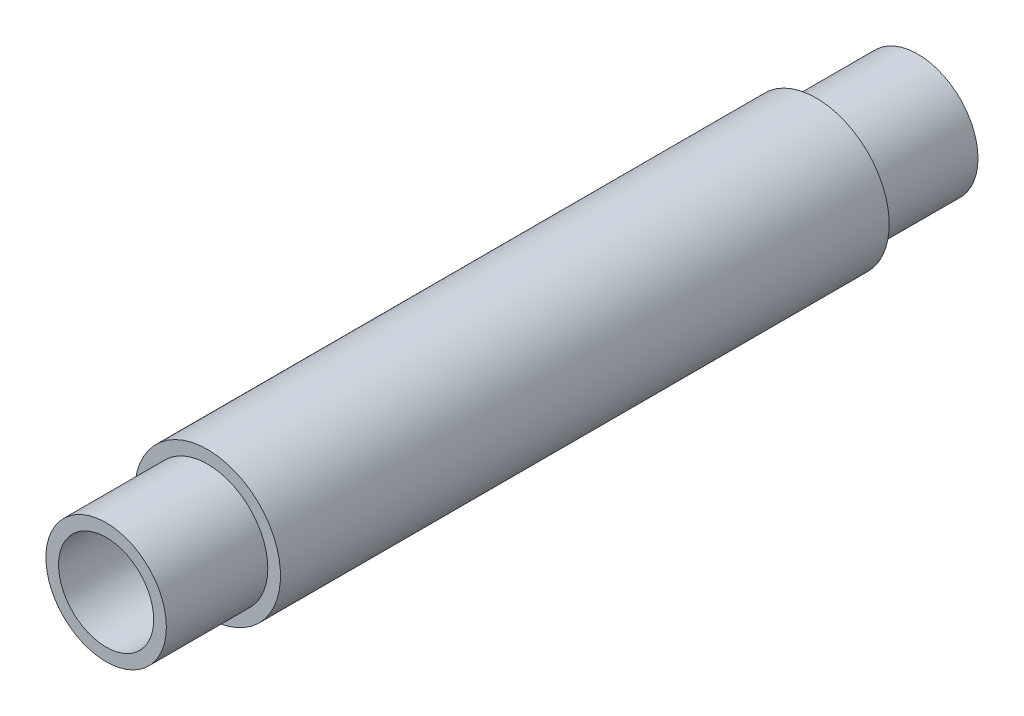
ISO-10303-21;
HEADER;
FILE_DESCRIPTION(('STEP AP214'),'2;1');
FILE_NAME('part.step','',(''),(''),'','','');
FILE_SCHEMA(('AUTOMOTIVE_DESIGN { 1 0 10303 214 1 1 1 1 }'));
ENDSEC;
DATA;
#1=APPLICATION_CONTEXT('core data for automotive mechanical design processes');
#2=APPLICATION_PROTOCOL_DEFINITION('international standard','automotive_design',2000,#1);
#3=PRODUCT_CONTEXT('',#1,'mechanical');
#4=PRODUCT('Part','Part','',(#3));
#5=PRODUCT_RELATED_PRODUCT_CATEGORY('part','',(#4));
#6=PRODUCT_DEFINITION_FORMATION('','',#4);
#7=PRODUCT_DEFINITION_CONTEXT('part definition',#1,'design');
#8=PRODUCT_DEFINITION('design','',#6,#7);
#9=PRODUCT_DEFINITION_SHAPE('','',#8);
#10=(LENGTH_UNIT() NAMED_UNIT(*) SI_UNIT(.MILLI.,.METRE.));
#11=(NAMED_UNIT(*) PLANE_ANGLE_UNIT() SI_UNIT($,.RADIAN.));
#12=(NAMED_UNIT(*) SI_UNIT($,.STERADIAN.) SOLID_ANGLE_UNIT());
#13=UNCERTAINTY_MEASURE_WITH_UNIT(LENGTH_MEASURE(1.E-05),#10,'distance_accuracy_value','');
#14=(GEOMETRIC_REPRESENTATION_CONTEXT(3) GLOBAL_UNCERTAINTY_ASSIGNED_CONTEXT((#13)) GLOBAL_UNIT_ASSIGNED_CONTEXT((#10,
#11,#12)) REPRESENTATION_CONTEXT('',''));
#15=CARTESIAN_POINT('',(0.,0.,0.));
#16=DIRECTION('',(0.,0.,1.));
#17=DIRECTION('',(1.,0.,0.));
#18=AXIS2_PLACEMENT_3D('',#15,#16,#17);
#19=CARTESIAN_POINT('',(0.,0.,101.6));
#20=DIRECTION('',(0.,0.,-1.));
#21=DIRECTION('',(-1.,0.,0.));
#22=AXIS2_PLACEMENT_3D('',#19,#20,#21);
#23=CYLINDRICAL_SURFACE('',#22,15.08125);
#24=CARTESIAN_POINT('',(0.,0.,-101.6));
#25=DIRECTION('',(0.,0.,1.));
#26=DIRECTION('',(1.,0.,0.));
#27=AXIS2_PLACEMENT_3D('',#24,#25,#26);
#28=CIRCLE('',#27,15.08125);
#29=CARTESIAN_POINT('',(15.08125,0.,-101.6));
#30=VERTEX_POINT('',#29);
#31=EDGE_CURVE('E40',#30,#30,#28,.T.);
#32=ORIENTED_EDGE('',*,*,#31,.T.);
#33=EDGE_LOOP('',(#32));
#34=FACE_BOUND('',#33,.T.);
#35=CARTESIAN_POINT('',(0.,0.,-76.2));
#36=DIRECTION('',(0.,0.,1.));
#37=DIRECTION('',(1.,0.,0.));
#38=AXIS2_PLACEMENT_3D('',#35,#36,#37);
#39=CIRCLE('',#38,15.08125);
#40=CARTESIAN_POINT('',(15.08125,0.,-76.2));
#41=VERTEX_POINT('',#40);
#42=EDGE_CURVE('E11',#41,#41,#39,.T.);
#43=ORIENTED_EDGE('',*,*,#42,.F.);
#44=EDGE_LOOP('',(#43));
#45=FACE_BOUND('',#44,.T.);
#46=ADVANCED_FACE('F36',(#34,#45),#23,.T.);
#47=CARTESIAN_POINT('',(0.,0.,101.6));
#48=DIRECTION('',(0.,0.,1.));
#49=DIRECTION('',(1.,0.,0.));
#50=AXIS2_PLACEMENT_3D('',#47,#48,#49);
#51=PLANE('',#50);
#52=CARTESIAN_POINT('',(0.,0.,101.6));
#53=DIRECTION('',(0.,0.,1.));
#54=DIRECTION('',(1.,0.,0.));
#55=AXIS2_PLACEMENT_3D('',#52,#53,#54);
#56=CIRCLE('',#55,15.08125);
#57=CARTESIAN_POINT('',(15.08125,0.,101.6));
#58=VERTEX_POINT('',#57);
#59=EDGE_CURVE('E44',#58,#58,#56,.T.);
#60=ORIENTED_EDGE('',*,*,#59,.T.);
#61=EDGE_LOOP('',(#60));
#62=FACE_BOUND('',#61,.T.);
#63=CARTESIAN_POINT('',(0.,0.,101.6));
#64=DIRECTION('',(0.,0.,1.));
#65=DIRECTION('',(1.,0.,0.));
#66=AXIS2_PLACEMENT_3D('',#63,#64,#65);
#67=CIRCLE('',#66,11.90625);
#68=CARTESIAN_POINT('',(11.90625,0.,101.6));
#69=VERTEX_POINT('',#68);
#70=EDGE_CURVE('E58',#69,#69,#67,.T.);
#71=ORIENTED_EDGE('',*,*,#70,.F.);
#72=EDGE_LOOP('',(#71));
#73=FACE_BOUND('',#72,.T.);
#74=ADVANCED_FACE('F82',(#62,#73),#51,.T.);
#75=CARTESIAN_POINT('',(0.,0.,-101.6));
#76=DIRECTION('',(0.,0.,1.));
#77=DIRECTION('',(1.,0.,0.));
#78=AXIS2_PLACEMENT_3D('',#75,#76,#77);
#79=PLANE('',#78);
#80=ORIENTED_EDGE('',*,*,#31,.F.);
#81=EDGE_LOOP('',(#80));
#82=FACE_BOUND('',#81,.T.);
#83=CARTESIAN_POINT('',(0.,0.,-101.6));
#84=DIRECTION('',(0.,0.,1.));
#85=DIRECTION('',(1.,0.,0.));
#86=AXIS2_PLACEMENT_3D('',#83,#84,#85);
#87=CIRCLE('',#86,11.90625);
#88=CARTESIAN_POINT('',(11.90625,0.,-101.6));
#89=VERTEX_POINT('',#88);
#90=EDGE_CURVE('E56',#89,#89,#87,.T.);
#91=ORIENTED_EDGE('',*,*,#90,.T.);
#92=EDGE_LOOP('',(#91));
#93=FACE_BOUND('',#92,.T.);
#94=ADVANCED_FACE('F64',(#82,#93),#79,.F.);
#95=CARTESIAN_POINT('',(0.,0.,76.2));
#96=DIRECTION('',(0.,0.,1.));
#97=DIRECTION('',(1.,0.,0.));
#98=AXIS2_PLACEMENT_3D('',#95,#96,#97);
#99=CIRCLE('',#98,15.08125);
#100=CARTESIAN_POINT('',(15.08125,0.,76.2));
#101=VERTEX_POINT('',#100);
#102=EDGE_CURVE('E53',#101,#101,#99,.T.);
#103=ORIENTED_EDGE('',*,*,#102,.T.);
#104=EDGE_LOOP('',(#103));
#105=FACE_BOUND('',#104,.T.);
#106=ORIENTED_EDGE('',*,*,#59,.F.);
#107=EDGE_LOOP('',(#106));
#108=FACE_BOUND('',#107,.T.);
#109=ADVANCED_FACE('F38',(#105,#108),#23,.T.);
#110=CARTESIAN_POINT('',(0.,0.,101.6));
#111=DIRECTION('',(0.,0.,-1.));
#112=DIRECTION('',(-1.,0.,0.));
#113=AXIS2_PLACEMENT_3D('',#110,#111,#112);
#114=CYLINDRICAL_SURFACE('',#113,11.90625);
#115=ORIENTED_EDGE('',*,*,#70,.T.);
#116=EDGE_LOOP('',(#115));
#117=FACE_BOUND('',#116,.T.);
#118=ORIENTED_EDGE('',*,*,#90,.F.);
#119=EDGE_LOOP('',(#118));
#120=FACE_BOUND('',#119,.T.);
#121=ADVANCED_FACE('F66',(#117,#120),#114,.F.);
#122=CARTESIAN_POINT('',(0.,0.,76.2));
#123=DIRECTION('',(0.,0.,1.));
#124=DIRECTION('',(1.,0.,0.));
#125=AXIS2_PLACEMENT_3D('',#122,#123,#124);
#126=PLANE('',#125);
#127=CARTESIAN_POINT('',(0.,0.,76.2));
#128=DIRECTION('',(0.,0.,1.));
#129=DIRECTION('',(1.,0.,0.));
#130=AXIS2_PLACEMENT_3D('',#127,#128,#129);
#131=CIRCLE('',#130,18.25625);
#132=CARTESIAN_POINT('',(-18.25625,0.,76.2));
#133=VERTEX_POINT('',#132);
#134=EDGE_CURVE('E57',#133,#133,#131,.T.);
#135=ORIENTED_EDGE('',*,*,#134,.T.);
#136=EDGE_LOOP('',(#135));
#137=FACE_BOUND('',#136,.T.);
#138=ORIENTED_EDGE('',*,*,#102,.F.);
#139=EDGE_LOOP('',(#138));
#140=FACE_BOUND('',#139,.T.);
#141=ADVANCED_FACE('F68',(#137,#140),#126,.T.);
#142=CARTESIAN_POINT('',(0.,0.,-76.2));
#143=DIRECTION('',(0.,0.,1.));
#144=DIRECTION('',(1.,0.,0.));
#145=AXIS2_PLACEMENT_3D('',#142,#143,#144);
#146=PLANE('',#145);
#147=CARTESIAN_POINT('',(0.,0.,-76.2));
#148=DIRECTION('',(0.,0.,1.));
#149=DIRECTION('',(1.,0.,0.));
#150=AXIS2_PLACEMENT_3D('',#147,#148,#149);
#151=CIRCLE('',#150,18.25625);
#152=CARTESIAN_POINT('',(-18.25625,0.,-76.2));
#153=VERTEX_POINT('',#152);
#154=EDGE_CURVE('E51',#153,#153,#151,.T.);
#155=ORIENTED_EDGE('',*,*,#154,.F.);
#156=EDGE_LOOP('',(#155));
#157=FACE_BOUND('',#156,.T.);
#158=ORIENTED_EDGE('',*,*,#42,.T.);
#159=EDGE_LOOP('',(#158));
#160=FACE_BOUND('',#159,.T.);
#161=ADVANCED_FACE('F75',(#157,#160),#146,.F.);
#162=CARTESIAN_POINT('',(0.,0.,76.2));
#163=DIRECTION('',(0.,0.,-1.));
#164=DIRECTION('',(-1.,0.,0.));
#165=AXIS2_PLACEMENT_3D('',#162,#163,#164);
#166=CYLINDRICAL_SURFACE('',#165,18.25625);
#167=CARTESIAN_POINT('',(-18.25625,0.,76.2));
#168=CARTESIAN_POINT('',(-18.25625,0.,74.6125));
#169=CARTESIAN_POINT('',(-18.25625,0.,73.025));
#170=CARTESIAN_POINT('',(-18.25625,0.,69.85));
#171=CARTESIAN_POINT('',(-18.25625,0.,68.2625));
#172=CARTESIAN_POINT('',(-18.25625,0.,65.0875));
#173=CARTESIAN_POINT('',(-18.25625,0.,63.5));
#174=CARTESIAN_POINT('',(-18.25625,0.,60.325));
#175=CARTESIAN_POINT('',(-18.25625,0.,58.7375));
#176=CARTESIAN_POINT('',(-18.25625,0.,55.5625));
#177=CARTESIAN_POINT('',(-18.25625,0.,53.975));
#178=CARTESIAN_POINT('',(-18.25625,0.,50.8));
#179=CARTESIAN_POINT('',(-18.25625,0.,49.2125));
#180=CARTESIAN_POINT('',(-18.25625,0.,46.0375));
#181=CARTESIAN_POINT('',(-18.25625,0.,44.45));
#182=CARTESIAN_POINT('',(-18.25625,0.,41.275));
#183=CARTESIAN_POINT('',(-18.25625,0.,39.6875));
#184=CARTESIAN_POINT('',(-18.25625,0.,36.5125));
#185=CARTESIAN_POINT('',(-18.25625,0.,34.925));
#186=CARTESIAN_POINT('',(-18.25625,0.,31.75));
#187=CARTESIAN_POINT('',(-18.25625,0.,30.1625));
#188=CARTESIAN_POINT('',(-18.25625,0.,26.9875));
#189=CARTESIAN_POINT('',(-18.25625,0.,25.4));
#190=CARTESIAN_POINT('',(-18.25625,0.,22.225));
#191=CARTESIAN_POINT('',(-18.25625,0.,20.6375));
#192=CARTESIAN_POINT('',(-18.25625,0.,17.4625));
#193=CARTESIAN_POINT('',(-18.25625,0.,15.875));
#194=CARTESIAN_POINT('',(-18.25625,0.,12.7));
#195=CARTESIAN_POINT('',(-18.25625,0.,11.1125));
#196=CARTESIAN_POINT('',(-18.25625,0.,7.93750000000001));
#197=CARTESIAN_POINT('',(-18.25625,0.,6.35));
#198=CARTESIAN_POINT('',(-18.25625,0.,3.175));
#199=CARTESIAN_POINT('',(-18.25625,0.,1.5875));
#200=CARTESIAN_POINT('',(-18.25625,0.,-1.5875));
#201=CARTESIAN_POINT('',(-18.25625,0.,-3.175));
#202=CARTESIAN_POINT('',(-18.25625,0.,-6.35));
#203=CARTESIAN_POINT('',(-18.25625,0.,-7.93750000000001));
#204=CARTESIAN_POINT('',(-18.25625,0.,-11.1125));
#205=CARTESIAN_POINT('',(-18.25625,0.,-12.7));
#206=CARTESIAN_POINT('',(-18.25625,0.,-15.875));
#207=CARTESIAN_POINT('',(-18.25625,0.,-17.4625));
#208=CARTESIAN_POINT('',(-18.25625,0.,-20.6375));
#209=CARTESIAN_POINT('',(-18.25625,0.,-22.225));
#210=CARTESIAN_POINT('',(-18.25625,0.,-25.4));
#211=CARTESIAN_POINT('',(-18.25625,0.,-26.9875));
#212=CARTESIAN_POINT('',(-18.25625,0.,-30.1625));
#213=CARTESIAN_POINT('',(-18.25625,0.,-31.75));
#214=CARTESIAN_POINT('',(-18.25625,0.,-34.925));
#215=CARTESIAN_POINT('',(-18.25625,0.,-36.5125));
#216=CARTESIAN_POINT('',(-18.25625,0.,-39.6875));
#217=CARTESIAN_POINT('',(-18.25625,0.,-41.275));
#218=CARTESIAN_POINT('',(-18.25625,0.,-44.45));
#219=CARTESIAN_POINT('',(-18.25625,0.,-46.0375));
#220=CARTESIAN_POINT('',(-18.25625,0.,-49.2125));
#221=CARTESIAN_POINT('',(-18.25625,0.,-50.8));
#222=CARTESIAN_POINT('',(-18.25625,0.,-53.975));
#223=CARTESIAN_POINT('',(-18.25625,0.,-55.5625));
#224=CARTESIAN_POINT('',(-18.25625,0.,-58.7375));
#225=CARTESIAN_POINT('',(-18.25625,0.,-60.325));
#226=CARTESIAN_POINT('',(-18.25625,0.,-63.5));
#227=CARTESIAN_POINT('',(-18.25625,0.,-65.0875));
#228=CARTESIAN_POINT('',(-18.25625,0.,-68.2625));
#229=CARTESIAN_POINT('',(-18.25625,0.,-69.85));
#230=CARTESIAN_POINT('',(-18.25625,0.,-73.025));
#231=CARTESIAN_POINT('',(-18.25625,0.,-74.6125));
#232=CARTESIAN_POINT('',(-18.25625,0.,-76.2));
#233=B_SPLINE_CURVE_WITH_KNOTS('',3,(#167,#168,#169,#170,#171,#172,#173,#174,#175,#176,#177,
#178,#179,#180,#181,#182,#183,#184,#185,#186,#187,#188,#189,#190,#191,#192,#193,#194,#195,#196,
#197,#198,#199,#200,#201,#202,#203,#204,#205,#206,#207,#208,#209,#210,#211,#212,#213,#214,#215,
#216,#217,#218,#219,#220,#221,#222,#223,#224,#225,#226,#227,#228,#229,#230,#231,#232),
.UNSPECIFIED.,.F.,.F.,(4,2,2,2,2,2,2,2,2,2,2,2,2,2,2,2,2,2,2,2,2,2,2,2,2,2,2,2,2,2,2,2,4),(0.,
4.7625,9.52500000000001,14.2875,19.05,23.8125,28.575,33.3375,38.1,42.8625,47.625,52.3875,57.15,
61.9125,66.675,71.4375,76.2,80.9625,85.725,90.4875,95.25,100.0125,104.775,109.5375,114.3,
119.0625,123.825,128.5875,133.35,138.1125,142.875,147.6375,152.4),.UNSPECIFIED.);
#234=EDGE_CURVE('BSEAM122',#133,#153,#233,.T.);
#235=ORIENTED_EDGE('',*,*,#134,.F.);
#236=ORIENTED_EDGE('',*,*,#154,.T.);
#237=ORIENTED_EDGE('',*,*,#234,.T.);
#238=ORIENTED_EDGE('',*,*,#234,.F.);
#239=EDGE_LOOP('',(#235,#237,#236,#238));
#240=FACE_BOUND('',#239,.T.);
#241=ADVANCED_FACE('F122',(#240),#166,.T.);
#242=CLOSED_SHELL('',(#46,#74,#94,#109,#121,#141,#161,#241));
#243=MANIFOLD_SOLID_BREP('B2',#242);
#244=ADVANCED_BREP_SHAPE_REPRESENTATION('',(#18,#243),#14);
#245=SHAPE_DEFINITION_REPRESENTATION(#9,#244);
ENDSEC;
END-ISO-10303-21;
